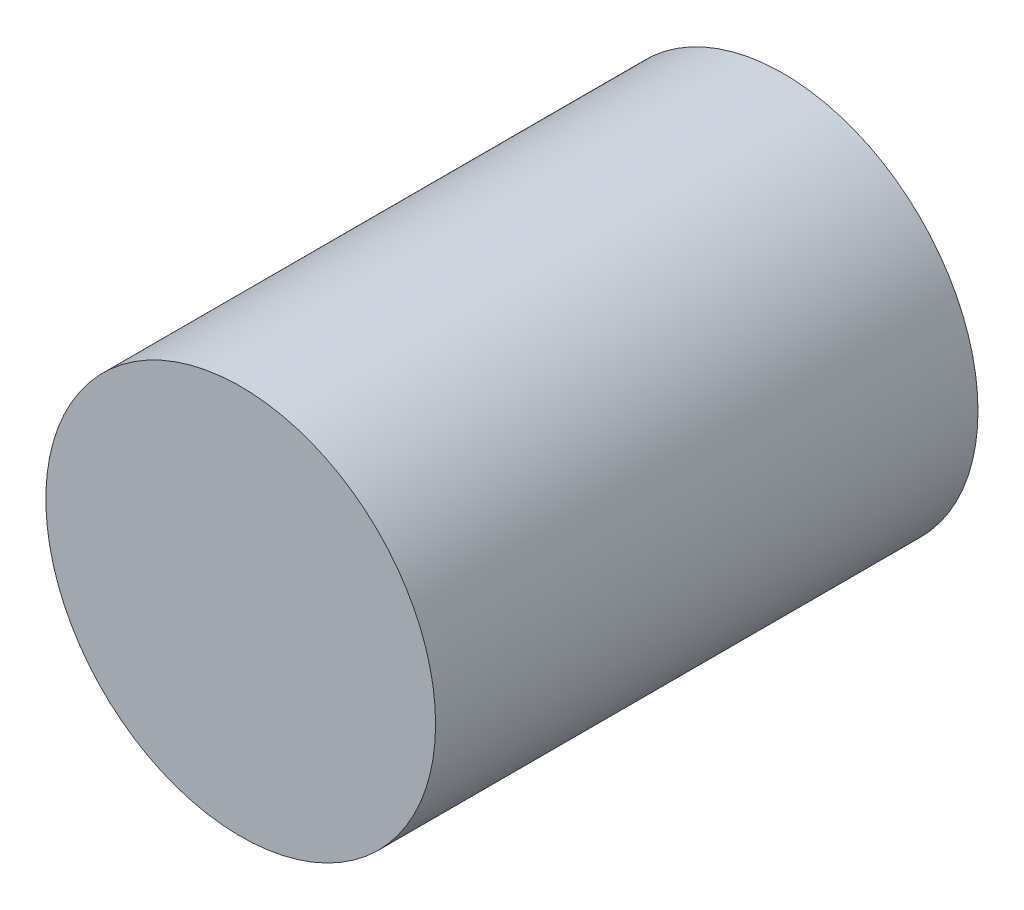
ISO-10303-21;
HEADER;
FILE_DESCRIPTION(('STEP AP214'),'2;1');
FILE_NAME('part.step','',(''),(''),'','','');
FILE_SCHEMA(('AUTOMOTIVE_DESIGN { 1 0 10303 214 1 1 1 1 }'));
ENDSEC;
DATA;
#1=APPLICATION_CONTEXT('core data for automotive mechanical design processes');
#2=APPLICATION_PROTOCOL_DEFINITION('international standard','automotive_design',2000,#1);
#3=PRODUCT_CONTEXT('',#1,'mechanical');
#4=PRODUCT('Part','Part','',(#3));
#5=PRODUCT_RELATED_PRODUCT_CATEGORY('part','',(#4));
#6=PRODUCT_DEFINITION_FORMATION('','',#4);
#7=PRODUCT_DEFINITION_CONTEXT('part definition',#1,'design');
#8=PRODUCT_DEFINITION('design','',#6,#7);
#9=PRODUCT_DEFINITION_SHAPE('','',#8);
#10=(LENGTH_UNIT() NAMED_UNIT(*) SI_UNIT(.MILLI.,.METRE.));
#11=(NAMED_UNIT(*) PLANE_ANGLE_UNIT() SI_UNIT($,.RADIAN.));
#12=(NAMED_UNIT(*) SI_UNIT($,.STERADIAN.) SOLID_ANGLE_UNIT());
#13=UNCERTAINTY_MEASURE_WITH_UNIT(LENGTH_MEASURE(1.E-05),#10,'distance_accuracy_value','');
#14=(GEOMETRIC_REPRESENTATION_CONTEXT(3) GLOBAL_UNCERTAINTY_ASSIGNED_CONTEXT((#13)) GLOBAL_UNIT_ASSIGNED_CONTEXT((#10,
#11,#12)) REPRESENTATION_CONTEXT('',''));
#15=CARTESIAN_POINT('',(0.,0.,0.));
#16=DIRECTION('',(0.,0.,1.));
#17=DIRECTION('',(1.,0.,0.));
#18=AXIS2_PLACEMENT_3D('',#15,#16,#17);
#19=CARTESIAN_POINT('',(0.,0.,8.35));
#20=DIRECTION('',(0.,0.,-1.));
#21=DIRECTION('',(-1.,0.,0.));
#22=AXIS2_PLACEMENT_3D('',#19,#20,#21);
#23=CYLINDRICAL_SURFACE('',#22,3.);
#24=CARTESIAN_POINT('',(0.,0.,8.35));
#25=DIRECTION('',(0.,0.,1.));
#26=DIRECTION('',(1.,0.,0.));
#27=AXIS2_PLACEMENT_3D('',#24,#25,#26);
#28=CIRCLE('',#27,3.);
#29=CARTESIAN_POINT('',(3.,0.,8.35));
#30=VERTEX_POINT('',#29);
#31=EDGE_CURVE('E10',#30,#30,#28,.T.);
#32=ORIENTED_EDGE('',*,*,#31,.F.);
#33=EDGE_LOOP('',(#32));
#34=FACE_BOUND('',#33,.T.);
#35=CARTESIAN_POINT('',(0.,0.,0.));
#36=DIRECTION('',(0.,0.,1.));
#37=DIRECTION('',(1.,0.,0.));
#38=AXIS2_PLACEMENT_3D('',#35,#36,#37);
#39=CIRCLE('',#38,3.);
#40=CARTESIAN_POINT('',(3.,0.,0.));
#41=VERTEX_POINT('',#40);
#42=EDGE_CURVE('E33',#41,#41,#39,.T.);
#43=ORIENTED_EDGE('',*,*,#42,.T.);
#44=EDGE_LOOP('',(#43));
#45=FACE_BOUND('',#44,.T.);
#46=ADVANCED_FACE('F30',(#34,#45),#23,.T.);
#47=CARTESIAN_POINT('',(0.,0.,8.35));
#48=DIRECTION('',(0.,0.,1.));
#49=DIRECTION('',(1.,0.,0.));
#50=AXIS2_PLACEMENT_3D('',#47,#48,#49);
#51=PLANE('',#50);
#52=ORIENTED_EDGE('',*,*,#31,.T.);
#53=EDGE_LOOP('',(#52));
#54=FACE_BOUND('',#53,.T.);
#55=ADVANCED_FACE('F45',(#54),#51,.T.);
#56=CARTESIAN_POINT('',(0.,0.,0.));
#57=DIRECTION('',(0.,0.,1.));
#58=DIRECTION('',(1.,0.,0.));
#59=AXIS2_PLACEMENT_3D('',#56,#57,#58);
#60=PLANE('',#59);
#61=ORIENTED_EDGE('',*,*,#42,.F.);
#62=EDGE_LOOP('',(#61));
#63=FACE_BOUND('',#62,.T.);
#64=ADVANCED_FACE('F43',(#63),#60,.F.);
#65=CLOSED_SHELL('',(#46,#55,#64));
#66=MANIFOLD_SOLID_BREP('B2',#65);
#67=ADVANCED_BREP_SHAPE_REPRESENTATION('',(#18,#66),#14);
#68=SHAPE_DEFINITION_REPRESENTATION(#9,#67);
ENDSEC;
END-ISO-10303-21;
